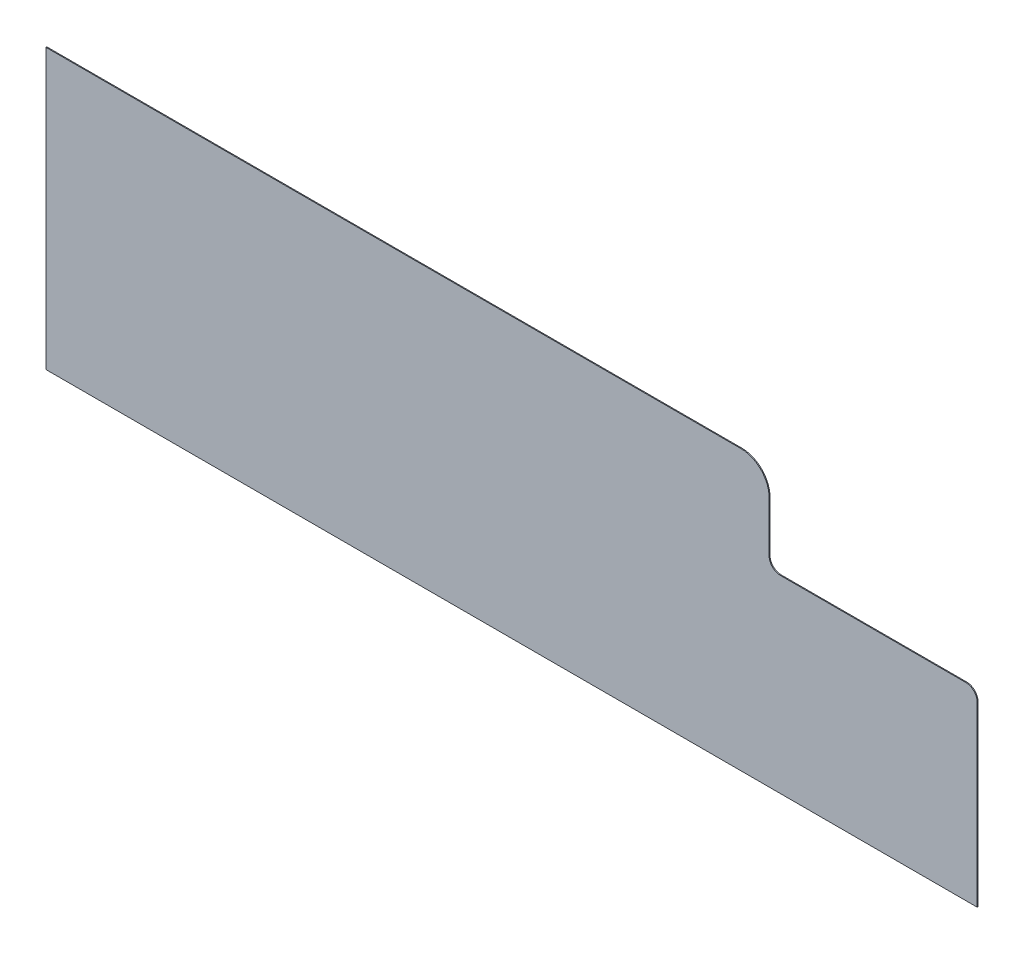
ISO-10303-21;
HEADER;
FILE_DESCRIPTION(('STEP AP214'),'2;1');
FILE_NAME('part.step','',(''),(''),'','','');
FILE_SCHEMA(('AUTOMOTIVE_DESIGN { 1 0 10303 214 1 1 1 1 }'));
ENDSEC;
DATA;
#1=APPLICATION_CONTEXT('core data for automotive mechanical design processes');
#2=APPLICATION_PROTOCOL_DEFINITION('international standard','automotive_design',2000,#1);
#3=PRODUCT_CONTEXT('',#1,'mechanical');
#4=PRODUCT('Part','Part','',(#3));
#5=PRODUCT_RELATED_PRODUCT_CATEGORY('part','',(#4));
#6=PRODUCT_DEFINITION_FORMATION('','',#4);
#7=PRODUCT_DEFINITION_CONTEXT('part definition',#1,'design');
#8=PRODUCT_DEFINITION('design','',#6,#7);
#9=PRODUCT_DEFINITION_SHAPE('','',#8);
#10=(LENGTH_UNIT() NAMED_UNIT(*) SI_UNIT(.MILLI.,.METRE.));
#11=(NAMED_UNIT(*) PLANE_ANGLE_UNIT() SI_UNIT($,.RADIAN.));
#12=(NAMED_UNIT(*) SI_UNIT($,.STERADIAN.) SOLID_ANGLE_UNIT());
#13=UNCERTAINTY_MEASURE_WITH_UNIT(LENGTH_MEASURE(1.E-05),#10,'distance_accuracy_value','');
#14=(GEOMETRIC_REPRESENTATION_CONTEXT(3) GLOBAL_UNCERTAINTY_ASSIGNED_CONTEXT((#13)) GLOBAL_UNIT_ASSIGNED_CONTEXT((#10,
#11,#12)) REPRESENTATION_CONTEXT('',''));
#15=CARTESIAN_POINT('',(0.,0.,0.));
#16=DIRECTION('',(0.,0.,1.));
#17=DIRECTION('',(1.,0.,0.));
#18=AXIS2_PLACEMENT_3D('',#15,#16,#17);
#19=CARTESIAN_POINT('',(547.966204503086,43.1321856287424,-1.5875));
#20=DIRECTION('',(1.,0.,0.));
#21=DIRECTION('',(0.,1.,0.));
#22=AXIS2_PLACEMENT_3D('',#19,#20,#21);
#23=PLANE('',#22);
#24=DIRECTION('',(0.,1.,0.));
#25=VECTOR('',#24,1.);
#26=CARTESIAN_POINT('',(547.966204503086,43.1321856287424,-1.5875));
#27=LINE('',#26,#25);
#28=CARTESIAN_POINT('',(547.966204503086,-292.267814371258,-1.5875));
#29=VERTEX_POINT('',#28);
#30=CARTESIAN_POINT('',(547.966204503086,23.1321856287424,-1.5875));
#31=VERTEX_POINT('',#30);
#32=EDGE_CURVE('E152',#29,#31,#27,.T.);
#33=ORIENTED_EDGE('',*,*,#32,.T.);
#34=DIRECTION('',(0.,0.,1.));
#35=VECTOR('',#34,1.);
#36=CARTESIAN_POINT('',(547.966204503086,23.1321856287424,-1.5875));
#37=LINE('',#36,#35);
#38=CARTESIAN_POINT('',(547.966204503086,23.1321856287424,0.));
#39=VERTEX_POINT('',#38);
#40=EDGE_CURVE('E174',#31,#39,#37,.T.);
#41=ORIENTED_EDGE('',*,*,#40,.T.);
#42=DIRECTION('',(0.,1.,0.));
#43=VECTOR('',#42,1.);
#44=CARTESIAN_POINT('',(547.966204503086,43.1321856287424,0.));
#45=LINE('',#44,#43);
#46=CARTESIAN_POINT('',(547.966204503086,-292.267814371258,0.));
#47=VERTEX_POINT('',#46);
#48=EDGE_CURVE('E139',#47,#39,#45,.T.);
#49=ORIENTED_EDGE('',*,*,#48,.F.);
#50=DIRECTION('',(0.,0.,1.));
#51=VECTOR('',#50,1.);
#52=CARTESIAN_POINT('',(547.966204503086,-292.267814371258,-1.5875));
#53=LINE('',#52,#51);
#54=EDGE_CURVE('E153',#29,#47,#53,.T.);
#55=ORIENTED_EDGE('',*,*,#54,.F.);
#56=EDGE_LOOP('',(#33,#41,#49,#55));
#57=FACE_BOUND('',#56,.T.);
#58=ADVANCED_FACE('F40',(#57),#23,.T.);
#59=CARTESIAN_POINT('',(-1104.97379549691,-292.267814371258,-1.5875));
#60=DIRECTION('',(0.,-1.,0.));
#61=DIRECTION('',(1.,0.,0.));
#62=AXIS2_PLACEMENT_3D('',#59,#60,#61);
#63=PLANE('',#62);
#64=DIRECTION('',(1.,0.,0.));
#65=VECTOR('',#64,1.);
#66=CARTESIAN_POINT('',(-1104.97379549691,-292.267814371258,0.));
#67=LINE('',#66,#65);
#68=CARTESIAN_POINT('',(-1104.97379549691,-292.267814371258,0.));
#69=VERTEX_POINT('',#68);
#70=EDGE_CURVE('E149',#69,#47,#67,.T.);
#71=ORIENTED_EDGE('',*,*,#70,.F.);
#72=DIRECTION('',(0.,0.,1.));
#73=VECTOR('',#72,1.);
#74=CARTESIAN_POINT('',(-1104.97379549691,-292.267814371258,-1.5875));
#75=LINE('',#74,#73);
#76=CARTESIAN_POINT('',(-1104.97379549691,-292.267814371258,-1.5875));
#77=VERTEX_POINT('',#76);
#78=EDGE_CURVE('E129',#77,#69,#75,.T.);
#79=ORIENTED_EDGE('',*,*,#78,.F.);
#80=DIRECTION('',(1.,0.,0.));
#81=VECTOR('',#80,1.);
#82=CARTESIAN_POINT('',(-1104.97379549691,-292.267814371258,-1.5875));
#83=LINE('',#82,#81);
#84=EDGE_CURVE('E130',#77,#29,#83,.T.);
#85=ORIENTED_EDGE('',*,*,#84,.T.);
#86=ORIENTED_EDGE('',*,*,#54,.T.);
#87=EDGE_LOOP('',(#71,#79,#85,#86));
#88=FACE_BOUND('',#87,.T.);
#89=ADVANCED_FACE('F186',(#88),#63,.T.);
#90=CARTESIAN_POINT('',(-1104.97379549691,203.132185628742,-1.5875));
#91=DIRECTION('',(-1.,0.,0.));
#92=DIRECTION('',(0.,0.,1.));
#93=AXIS2_PLACEMENT_3D('',#90,#91,#92);
#94=PLANE('',#93);
#95=DIRECTION('',(0.,-1.,0.));
#96=VECTOR('',#95,1.);
#97=CARTESIAN_POINT('',(-1104.97379549691,203.132185628742,0.));
#98=LINE('',#97,#96);
#99=CARTESIAN_POINT('',(-1104.97379549691,203.132185628742,0.));
#100=VERTEX_POINT('',#99);
#101=EDGE_CURVE('E128',#100,#69,#98,.T.);
#102=ORIENTED_EDGE('',*,*,#101,.F.);
#103=DIRECTION('',(0.,0.,1.));
#104=VECTOR('',#103,1.);
#105=CARTESIAN_POINT('',(-1104.97379549691,203.132185628742,-1.5875));
#106=LINE('',#105,#104);
#107=CARTESIAN_POINT('',(-1104.97379549691,203.132185628742,-1.5875));
#108=VERTEX_POINT('',#107);
#109=EDGE_CURVE('E113',#108,#100,#106,.T.);
#110=ORIENTED_EDGE('',*,*,#109,.F.);
#111=DIRECTION('',(0.,-1.,0.));
#112=VECTOR('',#111,1.);
#113=CARTESIAN_POINT('',(-1104.97379549691,203.132185628742,-1.5875));
#114=LINE('',#113,#112);
#115=EDGE_CURVE('E120',#108,#77,#114,.T.);
#116=ORIENTED_EDGE('',*,*,#115,.T.);
#117=ORIENTED_EDGE('',*,*,#78,.T.);
#118=EDGE_LOOP('',(#102,#110,#116,#117));
#119=FACE_BOUND('',#118,.T.);
#120=ADVANCED_FACE('F125',(#119),#94,.T.);
#121=CARTESIAN_POINT('',(-1104.97379549691,203.132185628742,-1.5875));
#122=DIRECTION('',(0.,1.,0.));
#123=DIRECTION('',(-1.,0.,0.));
#124=AXIS2_PLACEMENT_3D('',#121,#122,#123);
#125=PLANE('',#124);
#126=DIRECTION('',(-1.,0.,0.));
#127=VECTOR('',#126,1.);
#128=CARTESIAN_POINT('',(-1104.97379549691,203.132185628742,0.));
#129=LINE('',#128,#127);
#130=CARTESIAN_POINT('',(128.706204503086,203.132185628742,0.));
#131=VERTEX_POINT('',#130);
#132=EDGE_CURVE('E146',#131,#100,#129,.T.);
#133=ORIENTED_EDGE('',*,*,#132,.F.);
#134=DIRECTION('',(0.,0.,1.));
#135=VECTOR('',#134,1.);
#136=CARTESIAN_POINT('',(128.706204503086,203.132185628742,-1.5875));
#137=LINE('',#136,#135);
#138=CARTESIAN_POINT('',(128.706204503086,203.132185628742,-1.5875));
#139=VERTEX_POINT('',#138);
#140=EDGE_CURVE('E116',#131,#139,#137,.F.);
#141=ORIENTED_EDGE('',*,*,#140,.T.);
#142=DIRECTION('',(-1.,0.,0.));
#143=VECTOR('',#142,1.);
#144=CARTESIAN_POINT('',(-1104.97379549691,203.132185628742,-1.5875));
#145=LINE('',#144,#143);
#146=EDGE_CURVE('E109',#139,#108,#145,.T.);
#147=ORIENTED_EDGE('',*,*,#146,.T.);
#148=ORIENTED_EDGE('',*,*,#109,.T.);
#149=EDGE_LOOP('',(#133,#141,#147,#148));
#150=FACE_BOUND('',#149,.T.);
#151=ADVANCED_FACE('F112',(#150),#125,.T.);
#152=CARTESIAN_POINT('',(178.706204503086,43.1321856287424,-1.5875));
#153=DIRECTION('',(1.,0.,0.));
#154=DIRECTION('',(0.,0.,-1.));
#155=AXIS2_PLACEMENT_3D('',#152,#153,#154);
#156=PLANE('',#155);
#157=DIRECTION('',(0.,1.,0.));
#158=VECTOR('',#157,1.);
#159=CARTESIAN_POINT('',(178.706204503086,43.1321856287424,-1.5875));
#160=LINE('',#159,#158);
#161=CARTESIAN_POINT('',(178.706204503086,63.1321856287423,-1.5875));
#162=VERTEX_POINT('',#161);
#163=CARTESIAN_POINT('',(178.706204503086,153.132185628742,-1.5875));
#164=VERTEX_POINT('',#163);
#165=EDGE_CURVE('E121',#162,#164,#160,.T.);
#166=ORIENTED_EDGE('',*,*,#165,.T.);
#167=DIRECTION('',(0.,0.,1.));
#168=VECTOR('',#167,1.);
#169=CARTESIAN_POINT('',(178.706204503086,153.132185628742,-1.5875));
#170=LINE('',#169,#168);
#171=CARTESIAN_POINT('',(178.706204503086,153.132185628742,0.));
#172=VERTEX_POINT('',#171);
#173=EDGE_CURVE('E166',#164,#172,#170,.T.);
#174=ORIENTED_EDGE('',*,*,#173,.T.);
#175=DIRECTION('',(0.,1.,0.));
#176=VECTOR('',#175,1.);
#177=CARTESIAN_POINT('',(178.706204503086,43.1321856287424,0.));
#178=LINE('',#177,#176);
#179=CARTESIAN_POINT('',(178.706204503086,63.1321856287423,0.));
#180=VERTEX_POINT('',#179);
#181=EDGE_CURVE('E143',#180,#172,#178,.T.);
#182=ORIENTED_EDGE('',*,*,#181,.F.);
#183=DIRECTION('',(0.,0.,1.));
#184=VECTOR('',#183,1.);
#185=CARTESIAN_POINT('',(178.706204503086,63.1321856287424,-1.5875));
#186=LINE('',#185,#184);
#187=EDGE_CURVE('E159',#180,#162,#186,.F.);
#188=ORIENTED_EDGE('',*,*,#187,.T.);
#189=EDGE_LOOP('',(#166,#174,#182,#188));
#190=FACE_BOUND('',#189,.T.);
#191=ADVANCED_FACE('F194',(#190),#156,.T.);
#192=CARTESIAN_POINT('',(547.966204503086,43.1321856287424,-1.5875));
#193=DIRECTION('',(0.,1.,0.));
#194=DIRECTION('',(-1.,0.,0.));
#195=AXIS2_PLACEMENT_3D('',#192,#193,#194);
#196=PLANE('',#195);
#197=DIRECTION('',(-1.,0.,0.));
#198=VECTOR('',#197,1.);
#199=CARTESIAN_POINT('',(547.966204503086,43.1321856287424,0.));
#200=LINE('',#199,#198);
#201=CARTESIAN_POINT('',(527.966204503086,43.1321856287424,0.));
#202=VERTEX_POINT('',#201);
#203=CARTESIAN_POINT('',(198.706204503087,43.1321856287424,0.));
#204=VERTEX_POINT('',#203);
#205=EDGE_CURVE('E141',#202,#204,#200,.T.);
#206=ORIENTED_EDGE('',*,*,#205,.F.);
#207=DIRECTION('',(0.,0.,1.));
#208=VECTOR('',#207,1.);
#209=CARTESIAN_POINT('',(527.966204503086,43.1321856287424,-1.5875));
#210=LINE('',#209,#208);
#211=CARTESIAN_POINT('',(527.966204503086,43.1321856287424,-1.5875));
#212=VERTEX_POINT('',#211);
#213=EDGE_CURVE('E48',#202,#212,#210,.F.);
#214=ORIENTED_EDGE('',*,*,#213,.T.);
#215=DIRECTION('',(-1.,0.,0.));
#216=VECTOR('',#215,1.);
#217=CARTESIAN_POINT('',(547.966204503086,43.1321856287424,-1.5875));
#218=LINE('',#217,#216);
#219=CARTESIAN_POINT('',(198.706204503087,43.1321856287424,-1.5875));
#220=VERTEX_POINT('',#219);
#221=EDGE_CURVE('E187',#212,#220,#218,.T.);
#222=ORIENTED_EDGE('',*,*,#221,.T.);
#223=DIRECTION('',(0.,0.,1.));
#224=VECTOR('',#223,1.);
#225=CARTESIAN_POINT('',(198.706204503087,43.1321856287424,0.));
#226=LINE('',#225,#224);
#227=EDGE_CURVE('E155',#220,#204,#226,.T.);
#228=ORIENTED_EDGE('',*,*,#227,.T.);
#229=EDGE_LOOP('',(#206,#214,#222,#228));
#230=FACE_BOUND('',#229,.T.);
#231=ADVANCED_FACE('F216',(#230),#196,.T.);
#232=CARTESIAN_POINT('',(0.,0.,-1.5875));
#233=DIRECTION('',(0.,0.,1.));
#234=DIRECTION('',(1.,0.,0.));
#235=AXIS2_PLACEMENT_3D('',#232,#233,#234);
#236=PLANE('',#235);
#237=ORIENTED_EDGE('',*,*,#221,.F.);
#238=CARTESIAN_POINT('',(527.966204503086,23.1321856287424,-1.5875));
#239=DIRECTION('',(0.,0.,1.));
#240=DIRECTION('',(1.,0.,0.));
#241=AXIS2_PLACEMENT_3D('',#238,#239,#240);
#242=CIRCLE('',#241,20.);
#243=EDGE_CURVE('E11',#212,#31,#242,.F.);
#244=ORIENTED_EDGE('',*,*,#243,.T.);
#245=ORIENTED_EDGE('',*,*,#32,.F.);
#246=ORIENTED_EDGE('',*,*,#84,.F.);
#247=ORIENTED_EDGE('',*,*,#115,.F.);
#248=ORIENTED_EDGE('',*,*,#146,.F.);
#249=CARTESIAN_POINT('',(128.706204503086,153.132185628742,-1.5875));
#250=DIRECTION('',(0.,0.,1.));
#251=DIRECTION('',(1.,0.,0.));
#252=AXIS2_PLACEMENT_3D('',#249,#250,#251);
#253=CIRCLE('',#252,50.);
#254=EDGE_CURVE('E172',#139,#164,#253,.F.);
#255=ORIENTED_EDGE('',*,*,#254,.T.);
#256=ORIENTED_EDGE('',*,*,#165,.F.);
#257=CARTESIAN_POINT('',(198.706204503087,63.1321856287424,-1.5875));
#258=DIRECTION('',(0.,0.,1.));
#259=DIRECTION('',(1.,0.,0.));
#260=AXIS2_PLACEMENT_3D('',#257,#258,#259);
#261=CIRCLE('',#260,20.);
#262=EDGE_CURVE('E163',#162,#220,#261,.T.);
#263=ORIENTED_EDGE('',*,*,#262,.T.);
#264=EDGE_LOOP('',(#237,#244,#245,#246,#247,#248,#255,#256,#263));
#265=FACE_BOUND('',#264,.T.);
#266=ADVANCED_FACE('F132',(#265),#236,.F.);
#267=CARTESIAN_POINT('',(0.,0.,0.));
#268=DIRECTION('',(0.,0.,1.));
#269=DIRECTION('',(1.,0.,0.));
#270=AXIS2_PLACEMENT_3D('',#267,#268,#269);
#271=PLANE('',#270);
#272=ORIENTED_EDGE('',*,*,#48,.T.);
#273=CARTESIAN_POINT('',(527.966204503086,23.1321856287424,0.));
#274=DIRECTION('',(0.,0.,1.));
#275=DIRECTION('',(1.,0.,0.));
#276=AXIS2_PLACEMENT_3D('',#273,#274,#275);
#277=CIRCLE('',#276,20.);
#278=EDGE_CURVE('E62',#39,#202,#277,.T.);
#279=ORIENTED_EDGE('',*,*,#278,.T.);
#280=ORIENTED_EDGE('',*,*,#205,.T.);
#281=CARTESIAN_POINT('',(198.706204503087,63.1321856287424,0.));
#282=DIRECTION('',(0.,0.,1.));
#283=DIRECTION('',(1.,0.,0.));
#284=AXIS2_PLACEMENT_3D('',#281,#282,#283);
#285=CIRCLE('',#284,20.);
#286=EDGE_CURVE('E161',#204,#180,#285,.F.);
#287=ORIENTED_EDGE('',*,*,#286,.T.);
#288=ORIENTED_EDGE('',*,*,#181,.T.);
#289=CARTESIAN_POINT('',(128.706204503086,153.132185628742,0.));
#290=DIRECTION('',(0.,0.,1.));
#291=DIRECTION('',(1.,0.,0.));
#292=AXIS2_PLACEMENT_3D('',#289,#290,#291);
#293=CIRCLE('',#292,50.);
#294=EDGE_CURVE('E169',#172,#131,#293,.T.);
#295=ORIENTED_EDGE('',*,*,#294,.T.);
#296=ORIENTED_EDGE('',*,*,#132,.T.);
#297=ORIENTED_EDGE('',*,*,#101,.T.);
#298=ORIENTED_EDGE('',*,*,#70,.T.);
#299=EDGE_LOOP('',(#272,#279,#280,#287,#288,#295,#296,#297,#298));
#300=FACE_BOUND('',#299,.T.);
#301=ADVANCED_FACE('F183',(#300),#271,.T.);
#302=CARTESIAN_POINT('',(198.706204503087,63.1321856287424,-1.5875));
#303=DIRECTION('',(0.,0.,-1.));
#304=DIRECTION('',(-1.,0.,0.));
#305=AXIS2_PLACEMENT_3D('',#302,#303,#304);
#306=CYLINDRICAL_SURFACE('',#305,20.);
#307=ORIENTED_EDGE('',*,*,#262,.F.);
#308=ORIENTED_EDGE('',*,*,#187,.F.);
#309=ORIENTED_EDGE('',*,*,#286,.F.);
#310=ORIENTED_EDGE('',*,*,#227,.F.);
#311=EDGE_LOOP('',(#307,#308,#309,#310));
#312=FACE_BOUND('',#311,.T.);
#313=ADVANCED_FACE('F202',(#312),#306,.F.);
#314=CARTESIAN_POINT('',(128.706204503086,153.132185628742,-1.5875));
#315=DIRECTION('',(0.,0.,1.));
#316=DIRECTION('',(1.,0.,0.));
#317=AXIS2_PLACEMENT_3D('',#314,#315,#316);
#318=CYLINDRICAL_SURFACE('',#317,50.);
#319=ORIENTED_EDGE('',*,*,#254,.F.);
#320=ORIENTED_EDGE('',*,*,#140,.F.);
#321=ORIENTED_EDGE('',*,*,#294,.F.);
#322=ORIENTED_EDGE('',*,*,#173,.F.);
#323=EDGE_LOOP('',(#319,#320,#321,#322));
#324=FACE_BOUND('',#323,.T.);
#325=ADVANCED_FACE('F199',(#324),#318,.T.);
#326=CARTESIAN_POINT('',(527.966204503086,23.1321856287424,-1.5875));
#327=DIRECTION('',(0.,0.,1.));
#328=DIRECTION('',(1.,0.,0.));
#329=AXIS2_PLACEMENT_3D('',#326,#327,#328);
#330=CYLINDRICAL_SURFACE('',#329,20.);
#331=ORIENTED_EDGE('',*,*,#243,.F.);
#332=ORIENTED_EDGE('',*,*,#213,.F.);
#333=ORIENTED_EDGE('',*,*,#278,.F.);
#334=ORIENTED_EDGE('',*,*,#40,.F.);
#335=EDGE_LOOP('',(#331,#332,#333,#334));
#336=FACE_BOUND('',#335,.T.);
#337=ADVANCED_FACE('F42',(#336),#330,.T.);
#338=CLOSED_SHELL('',(#58,#89,#120,#151,#191,#231,#266,#301,#313,#325,#337));
#339=MANIFOLD_SOLID_BREP('B2',#338);
#340=ADVANCED_BREP_SHAPE_REPRESENTATION('',(#18,#339),#14);
#341=SHAPE_DEFINITION_REPRESENTATION(#9,#340);
ENDSEC;
END-ISO-10303-21;
